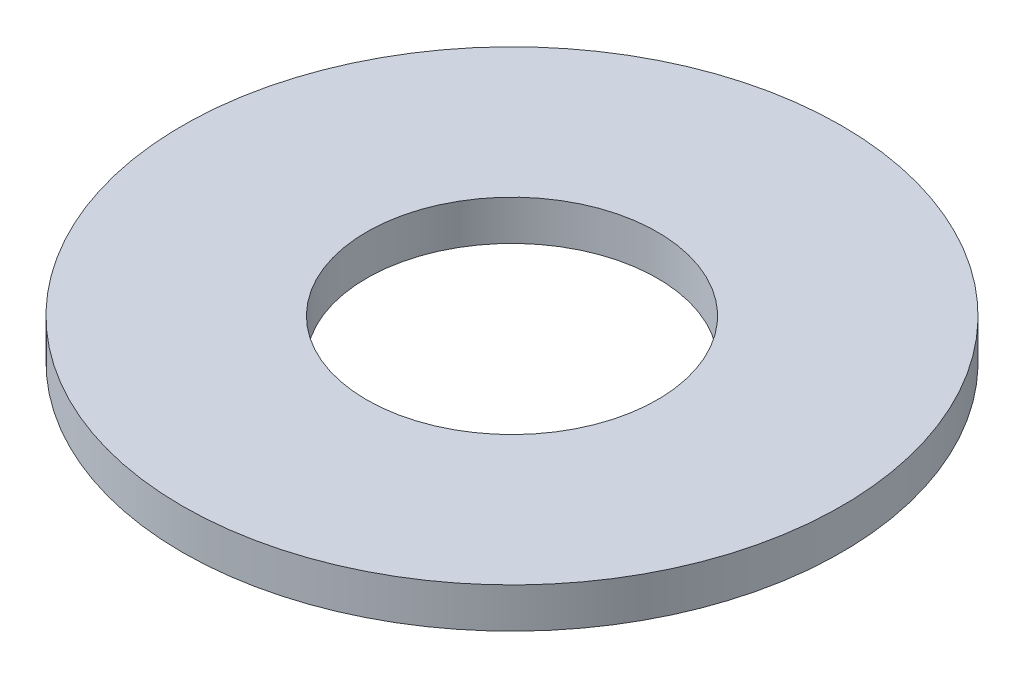
ISO-10303-21;
HEADER;
FILE_DESCRIPTION(('STEP AP214'),'2;1');
FILE_NAME('part.step','',(''),(''),'','','');
FILE_SCHEMA(('AUTOMOTIVE_DESIGN { 1 0 10303 214 1 1 1 1 }'));
ENDSEC;
DATA;
#1=APPLICATION_CONTEXT('core data for automotive mechanical design processes');
#2=APPLICATION_PROTOCOL_DEFINITION('international standard','automotive_design',2000,#1);
#3=PRODUCT_CONTEXT('',#1,'mechanical');
#4=PRODUCT('Part','Part','',(#3));
#5=PRODUCT_RELATED_PRODUCT_CATEGORY('part','',(#4));
#6=PRODUCT_DEFINITION_FORMATION('','',#4);
#7=PRODUCT_DEFINITION_CONTEXT('part definition',#1,'design');
#8=PRODUCT_DEFINITION('design','',#6,#7);
#9=PRODUCT_DEFINITION_SHAPE('','',#8);
#10=(LENGTH_UNIT() NAMED_UNIT(*) SI_UNIT(.MILLI.,.METRE.));
#11=(NAMED_UNIT(*) PLANE_ANGLE_UNIT() SI_UNIT($,.RADIAN.));
#12=(NAMED_UNIT(*) SI_UNIT($,.STERADIAN.) SOLID_ANGLE_UNIT());
#13=UNCERTAINTY_MEASURE_WITH_UNIT(LENGTH_MEASURE(1.E-05),#10,'distance_accuracy_value','');
#14=(GEOMETRIC_REPRESENTATION_CONTEXT(3) GLOBAL_UNCERTAINTY_ASSIGNED_CONTEXT((#13)) GLOBAL_UNIT_ASSIGNED_CONTEXT((#10,
#11,#12)) REPRESENTATION_CONTEXT('',''));
#15=CARTESIAN_POINT('',(0.,0.,0.));
#16=DIRECTION('',(0.,0.,1.));
#17=DIRECTION('',(1.,0.,0.));
#18=AXIS2_PLACEMENT_3D('',#15,#16,#17);
#19=CARTESIAN_POINT('',(0.,3.1,0.));
#20=DIRECTION('',(0.,-1.,0.));
#21=DIRECTION('',(0.,0.,-1.));
#22=AXIS2_PLACEMENT_3D('',#19,#20,#21);
#23=CYLINDRICAL_SURFACE('',#22,25.5);
#24=CARTESIAN_POINT('',(0.,3.1,0.));
#25=DIRECTION('',(0.,1.,0.));
#26=DIRECTION('',(0.,0.,1.));
#27=AXIS2_PLACEMENT_3D('',#24,#25,#26);
#28=CIRCLE('',#27,25.5);
#29=CARTESIAN_POINT('',(0.,3.1,-25.5));
#30=VERTEX_POINT('',#29);
#31=EDGE_CURVE('E10',#30,#30,#28,.T.);
#32=CARTESIAN_POINT('',(0.,0.,0.));
#33=DIRECTION('',(0.,1.,0.));
#34=DIRECTION('',(0.,0.,1.));
#35=AXIS2_PLACEMENT_3D('',#32,#33,#34);
#36=CIRCLE('',#35,25.5);
#37=CARTESIAN_POINT('',(0.,0.,-25.5));
#38=VERTEX_POINT('',#37);
#39=EDGE_CURVE('E34',#38,#38,#36,.T.);
#40=CARTESIAN_POINT('',(0.,3.1,-25.5));
#41=CARTESIAN_POINT('',(0.,3.06770833333333,-25.5));
#42=CARTESIAN_POINT('',(0.,3.03541666666667,-25.5));
#43=CARTESIAN_POINT('',(0.,2.97083333333333,-25.5));
#44=CARTESIAN_POINT('',(0.,2.93854166666667,-25.5));
#45=CARTESIAN_POINT('',(0.,2.87395833333333,-25.5));
#46=CARTESIAN_POINT('',(0.,2.84166666666667,-25.5));
#47=CARTESIAN_POINT('',(0.,2.77708333333333,-25.5));
#48=CARTESIAN_POINT('',(0.,2.74479166666667,-25.5));
#49=CARTESIAN_POINT('',(0.,2.68020833333333,-25.5));
#50=CARTESIAN_POINT('',(0.,2.64791666666667,-25.5));
#51=CARTESIAN_POINT('',(0.,2.58333333333333,-25.5));
#52=CARTESIAN_POINT('',(0.,2.55104166666667,-25.5));
#53=CARTESIAN_POINT('',(0.,2.48645833333333,-25.5));
#54=CARTESIAN_POINT('',(0.,2.45416666666667,-25.5));
#55=CARTESIAN_POINT('',(0.,2.38958333333333,-25.5));
#56=CARTESIAN_POINT('',(0.,2.35729166666667,-25.5));
#57=CARTESIAN_POINT('',(0.,2.29270833333333,-25.5));
#58=CARTESIAN_POINT('',(0.,2.26041666666667,-25.5));
#59=CARTESIAN_POINT('',(0.,2.19583333333333,-25.5));
#60=CARTESIAN_POINT('',(0.,2.16354166666667,-25.5));
#61=CARTESIAN_POINT('',(0.,2.09895833333333,-25.5));
#62=CARTESIAN_POINT('',(0.,2.06666666666667,-25.5));
#63=CARTESIAN_POINT('',(0.,2.00208333333333,-25.5));
#64=CARTESIAN_POINT('',(0.,1.96979166666667,-25.5));
#65=CARTESIAN_POINT('',(0.,1.90520833333333,-25.5));
#66=CARTESIAN_POINT('',(0.,1.87291666666667,-25.5));
#67=CARTESIAN_POINT('',(0.,1.80833333333333,-25.5));
#68=CARTESIAN_POINT('',(0.,1.77604166666667,-25.5));
#69=CARTESIAN_POINT('',(0.,1.71145833333333,-25.5));
#70=CARTESIAN_POINT('',(0.,1.67916666666667,-25.5));
#71=CARTESIAN_POINT('',(0.,1.61458333333333,-25.5));
#72=CARTESIAN_POINT('',(0.,1.58229166666667,-25.5));
#73=CARTESIAN_POINT('',(0.,1.51770833333333,-25.5));
#74=CARTESIAN_POINT('',(0.,1.48541666666667,-25.5));
#75=CARTESIAN_POINT('',(0.,1.42083333333333,-25.5));
#76=CARTESIAN_POINT('',(0.,1.38854166666667,-25.5));
#77=CARTESIAN_POINT('',(0.,1.32395833333333,-25.5));
#78=CARTESIAN_POINT('',(0.,1.29166666666667,-25.5));
#79=CARTESIAN_POINT('',(0.,1.22708333333333,-25.5));
#80=CARTESIAN_POINT('',(0.,1.19479166666667,-25.5));
#81=CARTESIAN_POINT('',(0.,1.13020833333333,-25.5));
#82=CARTESIAN_POINT('',(0.,1.09791666666667,-25.5));
#83=CARTESIAN_POINT('',(0.,1.03333333333333,-25.5));
#84=CARTESIAN_POINT('',(0.,1.00104166666667,-25.5));
#85=CARTESIAN_POINT('',(0.,0.936458333333333,-25.5));
#86=CARTESIAN_POINT('',(0.,0.904166666666667,-25.5));
#87=CARTESIAN_POINT('',(0.,0.839583333333334,-25.5));
#88=CARTESIAN_POINT('',(0.,0.807291666666667,-25.5));
#89=CARTESIAN_POINT('',(0.,0.742708333333333,-25.5));
#90=CARTESIAN_POINT('',(0.,0.710416666666667,-25.5));
#91=CARTESIAN_POINT('',(0.,0.645833333333333,-25.5));
#92=CARTESIAN_POINT('',(0.,0.613541666666667,-25.5));
#93=CARTESIAN_POINT('',(0.,0.548958333333333,-25.5));
#94=CARTESIAN_POINT('',(0.,0.516666666666667,-25.5));
#95=CARTESIAN_POINT('',(0.,0.452083333333333,-25.5));
#96=CARTESIAN_POINT('',(0.,0.419791666666667,-25.5));
#97=CARTESIAN_POINT('',(0.,0.355208333333333,-25.5));
#98=CARTESIAN_POINT('',(0.,0.322916666666667,-25.5));
#99=CARTESIAN_POINT('',(0.,0.258333333333333,-25.5));
#100=CARTESIAN_POINT('',(0.,0.226041666666667,-25.5));
#101=CARTESIAN_POINT('',(0.,0.161458333333333,-25.5));
#102=CARTESIAN_POINT('',(0.,0.129166666666667,-25.5));
#103=CARTESIAN_POINT('',(0.,0.0645833333333335,-25.5));
#104=CARTESIAN_POINT('',(0.,0.0322916666666667,-25.5));
#105=CARTESIAN_POINT('',(0.,0.,-25.5));
#106=B_SPLINE_CURVE_WITH_KNOTS('',3,(#40,#41,#42,#43,#44,#45,#46,#47,#48,#49,#50,#51,#52,#53,
#54,#55,#56,#57,#58,#59,#60,#61,#62,#63,#64,#65,#66,#67,#68,#69,#70,#71,#72,#73,#74,#75,#76,#77,
#78,#79,#80,#81,#82,#83,#84,#85,#86,#87,#88,#89,#90,#91,#92,#93,#94,#95,#96,#97,#98,#99,#100,
#101,#102,#103,#104,#105),.UNSPECIFIED.,.F.,.F.,(4,2,2,2,2,2,2,2,2,2,2,2,2,2,2,2,2,2,2,2,2,2,2,
2,2,2,2,2,2,2,2,2,4),(0.,0.0968750000000002,0.19375,0.290625,0.3875,0.484375,0.58125,0.678125,
0.775,0.871875,0.96875,1.065625,1.1625,1.259375,1.35625,1.453125,1.55,1.646875,1.74375,1.840625,
1.9375,2.034375,2.13125,2.228125,2.325,2.421875,2.51875,2.615625,2.7125,2.809375,2.90625,
3.003125,3.1),.UNSPECIFIED.);
#107=EDGE_CURVE('BSEAM31',#30,#38,#106,.T.);
#108=ORIENTED_EDGE('',*,*,#31,.F.);
#109=ORIENTED_EDGE('',*,*,#39,.T.);
#110=ORIENTED_EDGE('',*,*,#107,.T.);
#111=ORIENTED_EDGE('',*,*,#107,.F.);
#112=EDGE_LOOP('',(#108,#110,#109,#111));
#113=FACE_BOUND('',#112,.T.);
#114=ADVANCED_FACE('F31',(#113),#23,.T.);
#115=CARTESIAN_POINT('',(0.,3.1,0.));
#116=DIRECTION('',(0.,1.,0.));
#117=DIRECTION('',(0.,0.,1.));
#118=AXIS2_PLACEMENT_3D('',#115,#116,#117);
#119=PLANE('',#118);
#120=CARTESIAN_POINT('',(0.,3.1,0.));
#121=DIRECTION('',(0.,1.,0.));
#122=DIRECTION('',(0.,0.,1.));
#123=AXIS2_PLACEMENT_3D('',#120,#121,#122);
#124=CIRCLE('',#123,11.25);
#125=CARTESIAN_POINT('',(0.,3.1,11.25));
#126=VERTEX_POINT('',#125);
#127=EDGE_CURVE('E43',#126,#126,#124,.T.);
#128=ORIENTED_EDGE('',*,*,#127,.F.);
#129=EDGE_LOOP('',(#128));
#130=FACE_BOUND('',#129,.T.);
#131=ORIENTED_EDGE('',*,*,#31,.T.);
#132=EDGE_LOOP('',(#131));
#133=FACE_BOUND('',#132,.T.);
#134=ADVANCED_FACE('F58',(#130,#133),#119,.T.);
#135=CARTESIAN_POINT('',(0.,0.,0.));
#136=DIRECTION('',(0.,1.,0.));
#137=DIRECTION('',(0.,0.,1.));
#138=AXIS2_PLACEMENT_3D('',#135,#136,#137);
#139=PLANE('',#138);
#140=CARTESIAN_POINT('',(0.,0.,0.));
#141=DIRECTION('',(0.,1.,0.));
#142=DIRECTION('',(0.,0.,1.));
#143=AXIS2_PLACEMENT_3D('',#140,#141,#142);
#144=CIRCLE('',#143,11.25);
#145=CARTESIAN_POINT('',(0.,0.,11.25));
#146=VERTEX_POINT('',#145);
#147=EDGE_CURVE('E41',#146,#146,#144,.T.);
#148=ORIENTED_EDGE('',*,*,#147,.T.);
#149=EDGE_LOOP('',(#148));
#150=FACE_BOUND('',#149,.T.);
#151=ORIENTED_EDGE('',*,*,#39,.F.);
#152=EDGE_LOOP('',(#151));
#153=FACE_BOUND('',#152,.T.);
#154=ADVANCED_FACE('F49',(#150,#153),#139,.F.);
#155=CARTESIAN_POINT('',(0.,0.,0.));
#156=DIRECTION('',(0.,1.,0.));
#157=DIRECTION('',(0.,0.,1.));
#158=AXIS2_PLACEMENT_3D('',#155,#156,#157);
#159=CYLINDRICAL_SURFACE('',#158,11.25);
#160=CARTESIAN_POINT('',(0.,0.,11.25));
#161=CARTESIAN_POINT('',(0.,0.0322916666666666,11.25));
#162=CARTESIAN_POINT('',(0.,0.0645833333333333,11.25));
#163=CARTESIAN_POINT('',(0.,0.129166666666667,11.25));
#164=CARTESIAN_POINT('',(0.,0.161458333333333,11.25));
#165=CARTESIAN_POINT('',(0.,0.226041666666667,11.25));
#166=CARTESIAN_POINT('',(0.,0.258333333333333,11.25));
#167=CARTESIAN_POINT('',(0.,0.322916666666667,11.25));
#168=CARTESIAN_POINT('',(0.,0.355208333333333,11.25));
#169=CARTESIAN_POINT('',(0.,0.419791666666667,11.25));
#170=CARTESIAN_POINT('',(0.,0.452083333333333,11.25));
#171=CARTESIAN_POINT('',(0.,0.516666666666667,11.25));
#172=CARTESIAN_POINT('',(0.,0.548958333333333,11.25));
#173=CARTESIAN_POINT('',(0.,0.613541666666667,11.25));
#174=CARTESIAN_POINT('',(0.,0.645833333333333,11.25));
#175=CARTESIAN_POINT('',(0.,0.710416666666667,11.25));
#176=CARTESIAN_POINT('',(0.,0.742708333333333,11.25));
#177=CARTESIAN_POINT('',(0.,0.807291666666667,11.25));
#178=CARTESIAN_POINT('',(0.,0.839583333333333,11.25));
#179=CARTESIAN_POINT('',(0.,0.904166666666667,11.25));
#180=CARTESIAN_POINT('',(0.,0.936458333333333,11.25));
#181=CARTESIAN_POINT('',(0.,1.00104166666667,11.25));
#182=CARTESIAN_POINT('',(0.,1.03333333333333,11.25));
#183=CARTESIAN_POINT('',(0.,1.09791666666667,11.25));
#184=CARTESIAN_POINT('',(0.,1.13020833333333,11.25));
#185=CARTESIAN_POINT('',(0.,1.19479166666667,11.25));
#186=CARTESIAN_POINT('',(0.,1.22708333333333,11.25));
#187=CARTESIAN_POINT('',(0.,1.29166666666667,11.25));
#188=CARTESIAN_POINT('',(0.,1.32395833333333,11.25));
#189=CARTESIAN_POINT('',(0.,1.38854166666667,11.25));
#190=CARTESIAN_POINT('',(0.,1.42083333333333,11.25));
#191=CARTESIAN_POINT('',(0.,1.48541666666667,11.25));
#192=CARTESIAN_POINT('',(0.,1.51770833333333,11.25));
#193=CARTESIAN_POINT('',(0.,1.58229166666667,11.25));
#194=CARTESIAN_POINT('',(0.,1.61458333333333,11.25));
#195=CARTESIAN_POINT('',(0.,1.67916666666667,11.25));
#196=CARTESIAN_POINT('',(0.,1.71145833333333,11.25));
#197=CARTESIAN_POINT('',(0.,1.77604166666667,11.25));
#198=CARTESIAN_POINT('',(0.,1.80833333333333,11.25));
#199=CARTESIAN_POINT('',(0.,1.87291666666667,11.25));
#200=CARTESIAN_POINT('',(0.,1.90520833333333,11.25));
#201=CARTESIAN_POINT('',(0.,1.96979166666667,11.25));
#202=CARTESIAN_POINT('',(0.,2.00208333333333,11.25));
#203=CARTESIAN_POINT('',(0.,2.06666666666667,11.25));
#204=CARTESIAN_POINT('',(0.,2.09895833333333,11.25));
#205=CARTESIAN_POINT('',(0.,2.16354166666667,11.25));
#206=CARTESIAN_POINT('',(0.,2.19583333333333,11.25));
#207=CARTESIAN_POINT('',(0.,2.26041666666667,11.25));
#208=CARTESIAN_POINT('',(0.,2.29270833333333,11.25));
#209=CARTESIAN_POINT('',(0.,2.35729166666667,11.25));
#210=CARTESIAN_POINT('',(0.,2.38958333333333,11.25));
#211=CARTESIAN_POINT('',(0.,2.45416666666667,11.25));
#212=CARTESIAN_POINT('',(0.,2.48645833333333,11.25));
#213=CARTESIAN_POINT('',(0.,2.55104166666667,11.25));
#214=CARTESIAN_POINT('',(0.,2.58333333333333,11.25));
#215=CARTESIAN_POINT('',(0.,2.64791666666667,11.25));
#216=CARTESIAN_POINT('',(0.,2.68020833333333,11.25));
#217=CARTESIAN_POINT('',(0.,2.74479166666667,11.25));
#218=CARTESIAN_POINT('',(0.,2.77708333333333,11.25));
#219=CARTESIAN_POINT('',(0.,2.84166666666667,11.25));
#220=CARTESIAN_POINT('',(0.,2.87395833333333,11.25));
#221=CARTESIAN_POINT('',(0.,2.93854166666667,11.25));
#222=CARTESIAN_POINT('',(0.,2.97083333333333,11.25));
#223=CARTESIAN_POINT('',(0.,3.03541666666667,11.25));
#224=CARTESIAN_POINT('',(0.,3.06770833333333,11.25));
#225=CARTESIAN_POINT('',(0.,3.1,11.25));
#226=B_SPLINE_CURVE_WITH_KNOTS('',3,(#160,#161,#162,#163,#164,#165,#166,#167,#168,#169,#170,
#171,#172,#173,#174,#175,#176,#177,#178,#179,#180,#181,#182,#183,#184,#185,#186,#187,#188,#189,
#190,#191,#192,#193,#194,#195,#196,#197,#198,#199,#200,#201,#202,#203,#204,#205,#206,#207,#208,
#209,#210,#211,#212,#213,#214,#215,#216,#217,#218,#219,#220,#221,#222,#223,#224,#225),
.UNSPECIFIED.,.F.,.F.,(4,2,2,2,2,2,2,2,2,2,2,2,2,2,2,2,2,2,2,2,2,2,2,2,2,2,2,2,2,2,2,2,4),(0.,
0.096875,0.19375,0.290625,0.3875,0.484375,0.58125,0.678125,0.775,0.871875,0.96875,1.065625,
1.1625,1.259375,1.35625,1.453125,1.55,1.646875,1.74375,1.840625,1.9375,2.034375,2.13125,
2.228125,2.325,2.421875,2.51875,2.615625,2.7125,2.809375,2.90625,3.003125,3.1),.UNSPECIFIED.);
#227=EDGE_CURVE('BSEAM52',#146,#126,#226,.T.);
#228=ORIENTED_EDGE('',*,*,#147,.F.);
#229=ORIENTED_EDGE('',*,*,#127,.T.);
#230=ORIENTED_EDGE('',*,*,#227,.T.);
#231=ORIENTED_EDGE('',*,*,#227,.F.);
#232=EDGE_LOOP('',(#228,#230,#229,#231));
#233=FACE_BOUND('',#232,.T.);
#234=ADVANCED_FACE('F52',(#233),#159,.F.);
#235=CLOSED_SHELL('',(#114,#134,#154,#234));
#236=MANIFOLD_SOLID_BREP('B2',#235);
#237=ADVANCED_BREP_SHAPE_REPRESENTATION('',(#18,#236),#14);
#238=SHAPE_DEFINITION_REPRESENTATION(#9,#237);
ENDSEC;
END-ISO-10303-21;
